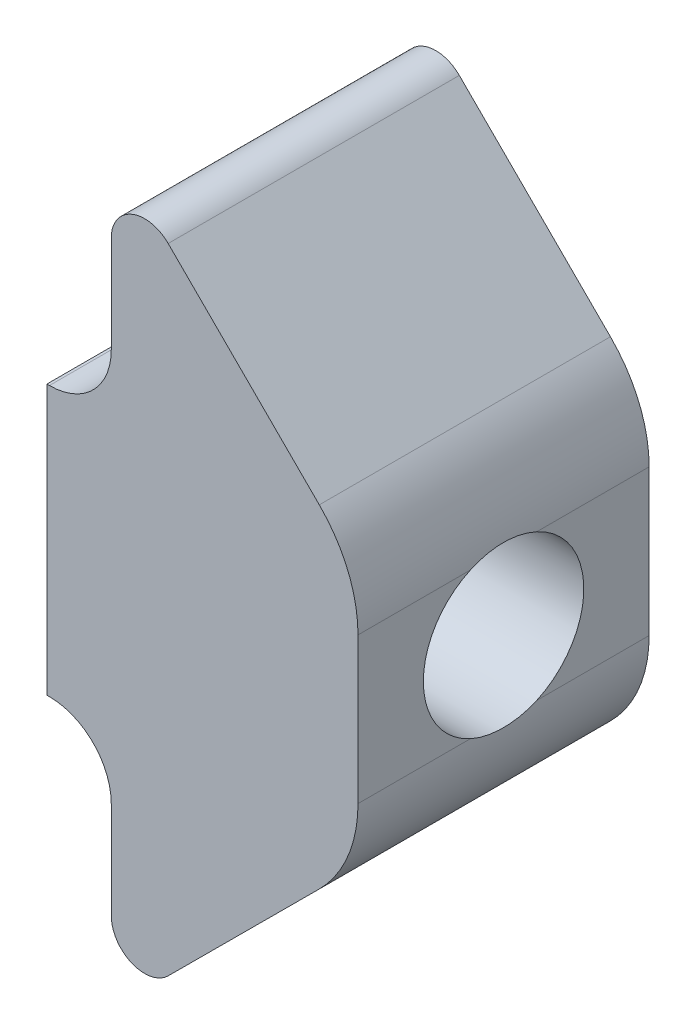
ISO-10303-21;
HEADER;
FILE_DESCRIPTION(('STEP AP214'),'2;1');
FILE_NAME('part.step','',(''),(''),'','','');
FILE_SCHEMA(('AUTOMOTIVE_DESIGN { 1 0 10303 214 1 1 1 1 }'));
ENDSEC;
DATA;
#1=APPLICATION_CONTEXT('core data for automotive mechanical design processes');
#2=APPLICATION_PROTOCOL_DEFINITION('international standard','automotive_design',2000,#1);
#3=PRODUCT_CONTEXT('',#1,'mechanical');
#4=PRODUCT('Part','Part','',(#3));
#5=PRODUCT_RELATED_PRODUCT_CATEGORY('part','',(#4));
#6=PRODUCT_DEFINITION_FORMATION('','',#4);
#7=PRODUCT_DEFINITION_CONTEXT('part definition',#1,'design');
#8=PRODUCT_DEFINITION('design','',#6,#7);
#9=PRODUCT_DEFINITION_SHAPE('','',#8);
#10=(LENGTH_UNIT() NAMED_UNIT(*) SI_UNIT(.MILLI.,.METRE.));
#11=(NAMED_UNIT(*) PLANE_ANGLE_UNIT() SI_UNIT($,.RADIAN.));
#12=(NAMED_UNIT(*) SI_UNIT($,.STERADIAN.) SOLID_ANGLE_UNIT());
#13=UNCERTAINTY_MEASURE_WITH_UNIT(LENGTH_MEASURE(1.E-05),#10,'distance_accuracy_value','');
#14=(GEOMETRIC_REPRESENTATION_CONTEXT(3) GLOBAL_UNCERTAINTY_ASSIGNED_CONTEXT((#13)) GLOBAL_UNIT_ASSIGNED_CONTEXT((#10,
#11,#12)) REPRESENTATION_CONTEXT('',''));
#15=CARTESIAN_POINT('',(0.,0.,0.));
#16=DIRECTION('',(0.,0.,1.));
#17=DIRECTION('',(1.,0.,0.));
#18=AXIS2_PLACEMENT_3D('',#15,#16,#17);
#19=CARTESIAN_POINT('',(-4.80850000000001,1.59318550686057,6.35));
#20=DIRECTION('',(1.,0.,0.));
#21=DIRECTION('',(0.,1.,0.));
#22=AXIS2_PLACEMENT_3D('',#19,#20,#21);
#23=PLANE('',#22);
#24=CARTESIAN_POINT('',(-4.80850000000001,0.,3.175));
#25=DIRECTION('',(1.,0.,0.));
#26=DIRECTION('',(0.,1.,0.));
#27=AXIS2_PLACEMENT_3D('',#24,#25,#26);
#28=CIRCLE('',#27,1.75);
#29=CARTESIAN_POINT('',(-4.8085,-1.59318550686057,3.89905796779638));
#30=VERTEX_POINT('',#29);
#31=CARTESIAN_POINT('',(-4.80850000000002,1.59318550686057,3.89905796779638));
#32=VERTEX_POINT('',#31);
#33=EDGE_CURVE('E289',#30,#32,#28,.F.);
#34=ORIENTED_EDGE('',*,*,#33,.T.);
#35=DIRECTION('',(0.,0.,-1.));
#36=VECTOR('',#35,1.);
#37=CARTESIAN_POINT('',(-4.80850000000002,1.59318550686057,6.35));
#38=LINE('',#37,#36);
#39=CARTESIAN_POINT('',(-4.80850000000002,1.59318550686057,6.35));
#40=VERTEX_POINT('',#39);
#41=EDGE_CURVE('E232',#40,#32,#38,.T.);
#42=ORIENTED_EDGE('',*,*,#41,.F.);
#43=DIRECTION('',(0.,-1.,0.));
#44=VECTOR('',#43,1.);
#45=CARTESIAN_POINT('',(-4.80850000000001,1.59318550686057,6.35));
#46=LINE('',#45,#44);
#47=CARTESIAN_POINT('',(-4.8085,-1.59318550686057,6.35));
#48=VERTEX_POINT('',#47);
#49=EDGE_CURVE('E341',#40,#48,#46,.T.);
#50=ORIENTED_EDGE('',*,*,#49,.T.);
#51=DIRECTION('',(0.,0.,-1.));
#52=VECTOR('',#51,1.);
#53=CARTESIAN_POINT('',(-4.8085,-1.59318550686057,6.35));
#54=LINE('',#53,#52);
#55=EDGE_CURVE('E228',#48,#30,#54,.T.);
#56=ORIENTED_EDGE('',*,*,#55,.T.);
#57=EDGE_LOOP('',(#34,#42,#50,#56));
#58=FACE_BOUND('',#57,.T.);
#59=ADVANCED_FACE('F36',(#58),#23,.T.);
#60=CARTESIAN_POINT('',(-11.5392124071298,-2.93845688183043,6.35));
#61=DIRECTION('',(0.,-1.,0.));
#62=DIRECTION('',(1.,0.,0.));
#63=AXIS2_PLACEMENT_3D('',#60,#61,#62);
#64=PLANE('',#63);
#65=DIRECTION('',(-1.,0.,0.));
#66=VECTOR('',#65,1.);
#67=CARTESIAN_POINT('',(-11.5392124071298,-2.93845688183043,0.));
#68=LINE('',#67,#66);
#69=CARTESIAN_POINT('',(-11.5392124071298,-2.93845688183043,0.));
#70=VERTEX_POINT('',#69);
#71=CARTESIAN_POINT('',(-11.5951,-2.93845688183043,0.));
#72=VERTEX_POINT('',#71);
#73=EDGE_CURVE('E182',#70,#72,#68,.T.);
#74=ORIENTED_EDGE('',*,*,#73,.F.);
#75=DIRECTION('',(0.,0.,-1.));
#76=VECTOR('',#75,1.);
#77=CARTESIAN_POINT('',(-11.5392124071298,-2.93845688183043,6.35));
#78=LINE('',#77,#76);
#79=CARTESIAN_POINT('',(-11.5392124071298,-2.93845688183043,6.35));
#80=VERTEX_POINT('',#79);
#81=EDGE_CURVE('E60',#80,#70,#78,.T.);
#82=ORIENTED_EDGE('',*,*,#81,.F.);
#83=DIRECTION('',(-1.,0.,0.));
#84=VECTOR('',#83,1.);
#85=CARTESIAN_POINT('',(-11.5392124071298,-2.93845688183043,6.35));
#86=LINE('',#85,#84);
#87=CARTESIAN_POINT('',(-11.5951,-2.93845688183043,6.35));
#88=VERTEX_POINT('',#87);
#89=EDGE_CURVE('E222',#80,#88,#86,.T.);
#90=ORIENTED_EDGE('',*,*,#89,.T.);
#91=DIRECTION('',(0.,0.,-1.));
#92=VECTOR('',#91,1.);
#93=CARTESIAN_POINT('',(-11.5951,-2.93845688183043,6.35));
#94=LINE('',#93,#92);
#95=EDGE_CURVE('E117',#88,#72,#94,.T.);
#96=ORIENTED_EDGE('',*,*,#95,.T.);
#97=EDGE_LOOP('',(#74,#82,#90,#96));
#98=FACE_BOUND('',#97,.T.);
#99=ADVANCED_FACE('F262',(#98),#64,.T.);
#100=CARTESIAN_POINT('',(-11.5392124071298,-4.28746928896025,6.35));
#101=DIRECTION('',(0.,0.,-1.));
#102=DIRECTION('',(-1.,0.,0.));
#103=AXIS2_PLACEMENT_3D('',#100,#101,#102);
#104=CYLINDRICAL_SURFACE('',#103,1.34901240712982);
#105=CARTESIAN_POINT('',(-11.5392124071298,-4.28746928896025,0.));
#106=DIRECTION('',(0.,0.,1.));
#107=DIRECTION('',(1.,0.,0.));
#108=AXIS2_PLACEMENT_3D('',#105,#106,#107);
#109=CIRCLE('',#108,1.34901240712982);
#110=CARTESIAN_POINT('',(-10.1902,-4.28746928896025,0.));
#111=VERTEX_POINT('',#110);
#112=EDGE_CURVE('E219',#111,#70,#109,.T.);
#113=ORIENTED_EDGE('',*,*,#112,.F.);
#114=DIRECTION('',(0.,0.,-1.));
#115=VECTOR('',#114,1.);
#116=CARTESIAN_POINT('',(-10.1902,-4.28746928896025,6.35));
#117=LINE('',#116,#115);
#118=CARTESIAN_POINT('',(-10.1902,-4.28746928896025,6.35));
#119=VERTEX_POINT('',#118);
#120=EDGE_CURVE('E165',#119,#111,#117,.T.);
#121=ORIENTED_EDGE('',*,*,#120,.F.);
#122=CARTESIAN_POINT('',(-11.5392124071298,-4.28746928896025,6.35));
#123=DIRECTION('',(0.,0.,1.));
#124=DIRECTION('',(1.,0.,0.));
#125=AXIS2_PLACEMENT_3D('',#122,#123,#124);
#126=CIRCLE('',#125,1.34901240712982);
#127=EDGE_CURVE('E177',#119,#80,#126,.T.);
#128=ORIENTED_EDGE('',*,*,#127,.T.);
#129=ORIENTED_EDGE('',*,*,#81,.T.);
#130=EDGE_LOOP('',(#113,#121,#128,#129));
#131=FACE_BOUND('',#130,.T.);
#132=ADVANCED_FACE('F269',(#131),#104,.F.);
#133=CARTESIAN_POINT('',(-10.1902,-6.4020890233125,6.35));
#134=DIRECTION('',(-1.,0.,0.));
#135=DIRECTION('',(0.,0.,1.));
#136=AXIS2_PLACEMENT_3D('',#133,#134,#135);
#137=PLANE('',#136);
#138=DIRECTION('',(0.,1.,0.));
#139=VECTOR('',#138,1.);
#140=CARTESIAN_POINT('',(-10.1902,-6.4020890233125,0.));
#141=LINE('',#140,#139);
#142=CARTESIAN_POINT('',(-10.1902,-6.4020890233125,0.));
#143=VERTEX_POINT('',#142);
#144=EDGE_CURVE('E161',#143,#111,#141,.T.);
#145=ORIENTED_EDGE('',*,*,#144,.F.);
#146=DIRECTION('',(0.,0.,-1.));
#147=VECTOR('',#146,1.);
#148=CARTESIAN_POINT('',(-10.1902,-6.4020890233125,6.35));
#149=LINE('',#148,#147);
#150=CARTESIAN_POINT('',(-10.1902,-6.4020890233125,6.35));
#151=VERTEX_POINT('',#150);
#152=EDGE_CURVE('E154',#151,#143,#149,.T.);
#153=ORIENTED_EDGE('',*,*,#152,.F.);
#154=DIRECTION('',(0.,1.,0.));
#155=VECTOR('',#154,1.);
#156=CARTESIAN_POINT('',(-10.1902,-6.4020890233125,6.35));
#157=LINE('',#156,#155);
#158=EDGE_CURVE('E158',#151,#119,#157,.T.);
#159=ORIENTED_EDGE('',*,*,#158,.T.);
#160=ORIENTED_EDGE('',*,*,#120,.T.);
#161=EDGE_LOOP('',(#145,#153,#159,#160));
#162=FACE_BOUND('',#161,.T.);
#163=ADVANCED_FACE('F156',(#162),#137,.T.);
#164=CARTESIAN_POINT('',(-9.4627890233125,-6.4020890233125,6.35));
#165=DIRECTION('',(0.,0.,-1.));
#166=DIRECTION('',(-1.,0.,0.));
#167=AXIS2_PLACEMENT_3D('',#164,#165,#166);
#168=CYLINDRICAL_SURFACE('',#167,0.727410976687497);
#169=CARTESIAN_POINT('',(-9.4627890233125,-6.4020890233125,0.));
#170=DIRECTION('',(0.,0.,1.));
#171=DIRECTION('',(1.,0.,0.));
#172=AXIS2_PLACEMENT_3D('',#169,#170,#171);
#173=CIRCLE('',#172,0.727410976687497);
#174=CARTESIAN_POINT('',(-8.9490205596463,-6.91703435511728,0.));
#175=VERTEX_POINT('',#174);
#176=EDGE_CURVE('E216',#143,#175,#173,.T.);
#177=ORIENTED_EDGE('',*,*,#176,.T.);
#178=DIRECTION('',(0.,0.,-1.));
#179=VECTOR('',#178,1.);
#180=CARTESIAN_POINT('',(-8.9490205596463,-6.91703435511728,6.35));
#181=LINE('',#180,#179);
#182=CARTESIAN_POINT('',(-8.9490205596463,-6.91703435511728,6.35));
#183=VERTEX_POINT('',#182);
#184=EDGE_CURVE('E166',#183,#175,#181,.T.);
#185=ORIENTED_EDGE('',*,*,#184,.F.);
#186=CARTESIAN_POINT('',(-9.4627890233125,-6.4020890233125,6.35));
#187=DIRECTION('',(0.,0.,1.));
#188=DIRECTION('',(1.,0.,0.));
#189=AXIS2_PLACEMENT_3D('',#186,#187,#188);
#190=CIRCLE('',#189,0.727410976687497);
#191=EDGE_CURVE('E169',#151,#183,#190,.T.);
#192=ORIENTED_EDGE('',*,*,#191,.F.);
#193=ORIENTED_EDGE('',*,*,#152,.T.);
#194=EDGE_LOOP('',(#177,#185,#192,#193));
#195=FACE_BOUND('',#194,.T.);
#196=ADVANCED_FACE('F170',(#195),#168,.T.);
#197=CARTESIAN_POINT('',(-5.65289504574608,-3.62844188377221,6.35));
#198=DIRECTION('',(0.706297375392672,-0.707915261534474,0.));
#199=DIRECTION('',(0.707915261534474,0.706297375392672,0.));
#200=AXIS2_PLACEMENT_3D('',#197,#198,#199);
#201=PLANE('',#200);
#202=DIRECTION('',(-0.707915261534474,-0.706297375392672,0.));
#203=VECTOR('',#202,1.);
#204=CARTESIAN_POINT('',(-5.65289504574608,-3.62844188377221,0.));
#205=LINE('',#204,#203);
#206=CARTESIAN_POINT('',(-5.65289504574608,-3.62844188377221,0.));
#207=VERTEX_POINT('',#206);
#208=EDGE_CURVE('E213',#207,#175,#205,.T.);
#209=ORIENTED_EDGE('',*,*,#208,.F.);
#210=DIRECTION('',(0.,0.,-1.));
#211=VECTOR('',#210,1.);
#212=CARTESIAN_POINT('',(-5.65289504574608,-3.62844188377221,6.35));
#213=LINE('',#212,#211);
#214=CARTESIAN_POINT('',(-5.65289504574608,-3.62844188377221,6.35));
#215=VERTEX_POINT('',#214);
#216=EDGE_CURVE('E226',#215,#207,#213,.T.);
#217=ORIENTED_EDGE('',*,*,#216,.F.);
#218=DIRECTION('',(-0.707915261534474,-0.706297375392672,0.));
#219=VECTOR('',#218,1.);
#220=CARTESIAN_POINT('',(-5.65289504574608,-3.62844188377221,6.35));
#221=LINE('',#220,#219);
#222=EDGE_CURVE('E174',#215,#183,#221,.T.);
#223=ORIENTED_EDGE('',*,*,#222,.T.);
#224=ORIENTED_EDGE('',*,*,#184,.T.);
#225=EDGE_LOOP('',(#209,#217,#223,#224));
#226=FACE_BOUND('',#225,.T.);
#227=ADVANCED_FACE('F283',(#226),#201,.T.);
#228=CARTESIAN_POINT('',(-7.68350000000002,-1.59318550686057,6.35));
#229=DIRECTION('',(0.,0.,-1.));
#230=DIRECTION('',(-1.,0.,0.));
#231=AXIS2_PLACEMENT_3D('',#228,#229,#230);
#232=CYLINDRICAL_SURFACE('',#231,2.87500000000003);
#233=CARTESIAN_POINT('',(-4.8085,-1.59318550686057,2.45094203220362));
#234=VERTEX_POINT('',#233);
#235=CARTESIAN_POINT('',(-4.8085,-1.59318550686057,0.));
#236=VERTEX_POINT('',#235);
#237=EDGE_CURVE('E231',#234,#236,#54,.T.);
#238=ORIENTED_EDGE('',*,*,#237,.F.);
#239=CARTESIAN_POINT('',(-4.8085,-1.59318550686057,3.89905796779638));
#240=CARTESIAN_POINT('',(-4.80850696578926,-1.61354211753861,3.8542775523129));
#241=CARTESIAN_POINT('',(-4.80871647230555,-1.63200069355745,3.80863808496439));
#242=CARTESIAN_POINT('',(-4.80934811754923,-1.66501233144936,3.71597040859976));
#243=CARTESIAN_POINT('',(-4.8097702507682,-1.67956549448328,3.66894223558993));
#244=CARTESIAN_POINT('',(-4.81063466138894,-1.70465621247682,3.57383065723409));
#245=CARTESIAN_POINT('',(-4.8110769360291,-1.71519431610204,3.52574739701821));
#246=CARTESIAN_POINT('',(-4.81185008773175,-1.73218559578378,3.4288778942963));
#247=CARTESIAN_POINT('',(-4.81218096923883,-1.73863893483173,3.38009167991921));
#248=CARTESIAN_POINT('',(-4.81285989864712,-1.75179425585051,3.23311644990264));
#249=CARTESIAN_POINT('',(-4.81289437645996,-1.75229438956668,3.13430001115188));
#250=CARTESIAN_POINT('',(-4.81207374150861,-1.73668178236994,2.93812966893667));
#251=CARTESIAN_POINT('',(-4.8112197917503,-1.72059076053768,2.84077402224094));
#252=CARTESIAN_POINT('',(-4.80989805860319,-1.68368869761242,2.69498106398093));
#253=CARTESIAN_POINT('',(-4.80943709761814,-1.66863545970306,2.64502559650784));
#254=CARTESIAN_POINT('',(-4.80874161613421,-1.63415650535987,2.54671482958506));
#255=CARTESIAN_POINT('',(-4.80850681723257,-1.61473620116796,2.4983576337145));
#256=CARTESIAN_POINT('',(-4.8085,-1.59318550686057,2.45094203220362));
#257=B_SPLINE_CURVE_WITH_KNOTS('',3,(#239,#240,#241,#242,#243,#244,#245,#246,#247,#248,#249,
#250,#251,#252,#253,#254,#255,#256),.UNSPECIFIED.,.F.,.F.,(4,2,2,2,2,2,2,2,4),(0.,
0.147521066360579,0.295038311154192,0.442535390195395,0.590026583394895,0.884975782653118,
1.17953936065454,1.33588250854209,1.49203295302535),.UNSPECIFIED.);
#258=EDGE_CURVE('E186',#30,#234,#257,.T.);
#259=ORIENTED_EDGE('',*,*,#258,.F.);
#260=ORIENTED_EDGE('',*,*,#55,.F.);
#261=CARTESIAN_POINT('',(-7.68350000000002,-1.59318550686057,6.35));
#262=DIRECTION('',(0.,0.,1.));
#263=DIRECTION('',(1.,0.,0.));
#264=AXIS2_PLACEMENT_3D('',#261,#262,#263);
#265=CIRCLE('',#264,2.87500000000003);
#266=EDGE_CURVE('E344',#215,#48,#265,.T.);
#267=ORIENTED_EDGE('',*,*,#266,.F.);
#268=ORIENTED_EDGE('',*,*,#216,.T.);
#269=CARTESIAN_POINT('',(-7.68350000000002,-1.59318550686057,0.));
#270=DIRECTION('',(0.,0.,1.));
#271=DIRECTION('',(1.,0.,0.));
#272=AXIS2_PLACEMENT_3D('',#269,#270,#271);
#273=CIRCLE('',#272,2.87500000000003);
#274=EDGE_CURVE('E210',#207,#236,#273,.T.);
#275=ORIENTED_EDGE('',*,*,#274,.T.);
#276=EDGE_LOOP('',(#238,#259,#260,#267,#268,#275));
#277=FACE_BOUND('',#276,.T.);
#278=ADVANCED_FACE('F275',(#277),#232,.T.);
#279=CARTESIAN_POINT('',(-4.80850000000002,1.59318550686057,2.45094203220364));
#280=VERTEX_POINT('',#279);
#281=EDGE_CURVE('E51',#280,#234,#28,.F.);
#282=ORIENTED_EDGE('',*,*,#281,.T.);
#283=ORIENTED_EDGE('',*,*,#237,.T.);
#284=DIRECTION('',(0.,-1.,0.));
#285=VECTOR('',#284,1.);
#286=CARTESIAN_POINT('',(-4.80850000000001,1.59318550686057,0.));
#287=LINE('',#286,#285);
#288=CARTESIAN_POINT('',(-4.80850000000002,1.59318550686057,0.));
#289=VERTEX_POINT('',#288);
#290=EDGE_CURVE('E207',#289,#236,#287,.T.);
#291=ORIENTED_EDGE('',*,*,#290,.F.);
#292=EDGE_CURVE('E235',#280,#289,#38,.T.);
#293=ORIENTED_EDGE('',*,*,#292,.F.);
#294=EDGE_LOOP('',(#282,#283,#291,#293));
#295=FACE_BOUND('',#294,.T.);
#296=ADVANCED_FACE('F265',(#295),#23,.T.);
#297=CARTESIAN_POINT('',(-7.68350000000002,1.59318550686057,6.35));
#298=DIRECTION('',(0.,0.,-1.));
#299=DIRECTION('',(-1.,0.,0.));
#300=AXIS2_PLACEMENT_3D('',#297,#298,#299);
#301=CYLINDRICAL_SURFACE('',#300,2.87500000000001);
#302=ORIENTED_EDGE('',*,*,#41,.T.);
#303=CARTESIAN_POINT('',(-4.80850000000002,1.59318550686057,2.45094203220362));
#304=CARTESIAN_POINT('',(-4.80850696578928,1.61354211753861,2.4957224476871));
#305=CARTESIAN_POINT('',(-4.80871647230557,1.63200069355745,2.54136191503561));
#306=CARTESIAN_POINT('',(-4.80934811754925,1.66501233144936,2.63402959140024));
#307=CARTESIAN_POINT('',(-4.80977025076822,1.67956549448328,2.68105776441007));
#308=CARTESIAN_POINT('',(-4.81063466138896,1.70465621247682,2.77616934276591));
#309=CARTESIAN_POINT('',(-4.81107693602912,1.71519431610204,2.82425260298179));
#310=CARTESIAN_POINT('',(-4.81185008773176,1.73218559578378,2.9211221057037));
#311=CARTESIAN_POINT('',(-4.81218096923885,1.73863893483173,2.96990832008079));
#312=CARTESIAN_POINT('',(-4.81285989864714,1.75179425585051,3.11688355009736));
#313=CARTESIAN_POINT('',(-4.81289437645998,1.75229438956668,3.21569998884813));
#314=CARTESIAN_POINT('',(-4.81207374150863,1.73668178236994,3.41187033106333));
#315=CARTESIAN_POINT('',(-4.81121979175032,1.72059076053768,3.50922597775906));
#316=CARTESIAN_POINT('',(-4.80989805860321,1.68368869761242,3.65501893601908));
#317=CARTESIAN_POINT('',(-4.80943709761815,1.66863545970306,3.70497440349217));
#318=CARTESIAN_POINT('',(-4.80874161613422,1.63415650535987,3.80328517041494));
#319=CARTESIAN_POINT('',(-4.80850681723258,1.61473620116796,3.8516423662855));
#320=CARTESIAN_POINT('',(-4.80850000000002,1.59318550686057,3.89905796779638));
#321=B_SPLINE_CURVE_WITH_KNOTS('',3,(#303,#304,#305,#306,#307,#308,#309,#310,#311,#312,#313,
#314,#315,#316,#317,#318,#319,#320),.UNSPECIFIED.,.F.,.F.,(4,2,2,2,2,2,2,2,4),(0.,
0.147521066360579,0.295038311154192,0.442535390195396,0.590026583394895,0.884975782653119,
1.17953936065454,1.33588250854209,1.49203295302535),.UNSPECIFIED.);
#322=EDGE_CURVE('E303',#280,#32,#321,.T.);
#323=ORIENTED_EDGE('',*,*,#322,.F.);
#324=ORIENTED_EDGE('',*,*,#292,.T.);
#325=CARTESIAN_POINT('',(-7.68350000000002,1.59318550686057,0.));
#326=DIRECTION('',(0.,0.,1.));
#327=DIRECTION('',(1.,0.,0.));
#328=AXIS2_PLACEMENT_3D('',#325,#326,#327);
#329=CIRCLE('',#328,2.87500000000001);
#330=CARTESIAN_POINT('',(-5.65289504574608,3.62844188377218,0.));
#331=VERTEX_POINT('',#330);
#332=EDGE_CURVE('E204',#289,#331,#329,.T.);
#333=ORIENTED_EDGE('',*,*,#332,.T.);
#334=DIRECTION('',(0.,0.,-1.));
#335=VECTOR('',#334,1.);
#336=CARTESIAN_POINT('',(-5.65289504574608,3.62844188377218,6.35));
#337=LINE('',#336,#335);
#338=CARTESIAN_POINT('',(-5.65289504574608,3.62844188377218,6.35));
#339=VERTEX_POINT('',#338);
#340=EDGE_CURVE('E236',#339,#331,#337,.T.);
#341=ORIENTED_EDGE('',*,*,#340,.F.);
#342=CARTESIAN_POINT('',(-7.68350000000002,1.59318550686057,6.35));
#343=DIRECTION('',(0.,0.,1.));
#344=DIRECTION('',(1.,0.,0.));
#345=AXIS2_PLACEMENT_3D('',#342,#343,#344);
#346=CIRCLE('',#345,2.87500000000001);
#347=EDGE_CURVE('E339',#40,#339,#346,.T.);
#348=ORIENTED_EDGE('',*,*,#347,.F.);
#349=EDGE_LOOP('',(#302,#323,#324,#333,#341,#348));
#350=FACE_BOUND('',#349,.T.);
#351=ADVANCED_FACE('F274',(#350),#301,.T.);
#352=CARTESIAN_POINT('',(-8.9490205596463,6.91703435511728,6.35));
#353=DIRECTION('',(0.706297375392675,0.707915261534471,0.));
#354=DIRECTION('',(-0.707915261534471,0.706297375392675,0.));
#355=AXIS2_PLACEMENT_3D('',#352,#353,#354);
#356=PLANE('',#355);
#357=DIRECTION('',(0.707915261534471,-0.706297375392675,0.));
#358=VECTOR('',#357,1.);
#359=CARTESIAN_POINT('',(-8.9490205596463,6.91703435511728,0.));
#360=LINE('',#359,#358);
#361=CARTESIAN_POINT('',(-8.9490205596463,6.91703435511727,0.));
#362=VERTEX_POINT('',#361);
#363=EDGE_CURVE('E201',#362,#331,#360,.T.);
#364=ORIENTED_EDGE('',*,*,#363,.F.);
#365=DIRECTION('',(0.,0.,-1.));
#366=VECTOR('',#365,1.);
#367=CARTESIAN_POINT('',(-8.9490205596463,6.91703435511727,6.35));
#368=LINE('',#367,#366);
#369=CARTESIAN_POINT('',(-8.9490205596463,6.91703435511727,6.35));
#370=VERTEX_POINT('',#369);
#371=EDGE_CURVE('E238',#370,#362,#368,.T.);
#372=ORIENTED_EDGE('',*,*,#371,.F.);
#373=DIRECTION('',(0.707915261534471,-0.706297375392675,0.));
#374=VECTOR('',#373,1.);
#375=CARTESIAN_POINT('',(-8.9490205596463,6.91703435511728,6.35));
#376=LINE('',#375,#374);
#377=EDGE_CURVE('E337',#370,#339,#376,.T.);
#378=ORIENTED_EDGE('',*,*,#377,.T.);
#379=ORIENTED_EDGE('',*,*,#340,.T.);
#380=EDGE_LOOP('',(#364,#372,#378,#379));
#381=FACE_BOUND('',#380,.T.);
#382=ADVANCED_FACE('F281',(#381),#356,.T.);
#383=CARTESIAN_POINT('',(-9.4627890233125,6.4020890233125,6.35));
#384=DIRECTION('',(0.,0.,-1.));
#385=DIRECTION('',(-1.,0.,0.));
#386=AXIS2_PLACEMENT_3D('',#383,#384,#385);
#387=CYLINDRICAL_SURFACE('',#386,0.727410976687497);
#388=CARTESIAN_POINT('',(-9.4627890233125,6.4020890233125,0.));
#389=DIRECTION('',(0.,0.,1.));
#390=DIRECTION('',(1.,0.,0.));
#391=AXIS2_PLACEMENT_3D('',#388,#389,#390);
#392=CIRCLE('',#391,0.727410976687497);
#393=CARTESIAN_POINT('',(-10.1902,6.4020890233125,0.));
#394=VERTEX_POINT('',#393);
#395=EDGE_CURVE('E198',#362,#394,#392,.T.);
#396=ORIENTED_EDGE('',*,*,#395,.T.);
#397=DIRECTION('',(0.,0.,-1.));
#398=VECTOR('',#397,1.);
#399=CARTESIAN_POINT('',(-10.1902,6.4020890233125,6.35));
#400=LINE('',#399,#398);
#401=CARTESIAN_POINT('',(-10.1902,6.4020890233125,6.35));
#402=VERTEX_POINT('',#401);
#403=EDGE_CURVE('E240',#402,#394,#400,.T.);
#404=ORIENTED_EDGE('',*,*,#403,.F.);
#405=CARTESIAN_POINT('',(-9.4627890233125,6.4020890233125,6.35));
#406=DIRECTION('',(0.,0.,1.));
#407=DIRECTION('',(1.,0.,0.));
#408=AXIS2_PLACEMENT_3D('',#405,#406,#407);
#409=CIRCLE('',#408,0.727410976687497);
#410=EDGE_CURVE('E335',#370,#402,#409,.T.);
#411=ORIENTED_EDGE('',*,*,#410,.F.);
#412=ORIENTED_EDGE('',*,*,#371,.T.);
#413=EDGE_LOOP('',(#396,#404,#411,#412));
#414=FACE_BOUND('',#413,.T.);
#415=ADVANCED_FACE('F353',(#414),#387,.T.);
#416=CARTESIAN_POINT('',(-10.1902,4.28746928896025,6.35));
#417=DIRECTION('',(-1.,0.,0.));
#418=DIRECTION('',(0.,0.,1.));
#419=AXIS2_PLACEMENT_3D('',#416,#417,#418);
#420=PLANE('',#419);
#421=DIRECTION('',(0.,1.,0.));
#422=VECTOR('',#421,1.);
#423=CARTESIAN_POINT('',(-10.1902,4.28746928896025,0.));
#424=LINE('',#423,#422);
#425=CARTESIAN_POINT('',(-10.1902,4.28746928896025,0.));
#426=VERTEX_POINT('',#425);
#427=EDGE_CURVE('E195',#426,#394,#424,.T.);
#428=ORIENTED_EDGE('',*,*,#427,.F.);
#429=DIRECTION('',(0.,0.,-1.));
#430=VECTOR('',#429,1.);
#431=CARTESIAN_POINT('',(-10.1902,4.28746928896025,6.35));
#432=LINE('',#431,#430);
#433=CARTESIAN_POINT('',(-10.1902,4.28746928896025,6.35));
#434=VERTEX_POINT('',#433);
#435=EDGE_CURVE('E242',#434,#426,#432,.T.);
#436=ORIENTED_EDGE('',*,*,#435,.F.);
#437=DIRECTION('',(0.,1.,0.));
#438=VECTOR('',#437,1.);
#439=CARTESIAN_POINT('',(-10.1902,4.28746928896025,6.35));
#440=LINE('',#439,#438);
#441=EDGE_CURVE('E332',#434,#402,#440,.T.);
#442=ORIENTED_EDGE('',*,*,#441,.T.);
#443=ORIENTED_EDGE('',*,*,#403,.T.);
#444=EDGE_LOOP('',(#428,#436,#442,#443));
#445=FACE_BOUND('',#444,.T.);
#446=ADVANCED_FACE('F356',(#445),#420,.T.);
#447=CARTESIAN_POINT('',(-11.5392124071298,4.28746928896025,6.35));
#448=DIRECTION('',(0.,0.,-1.));
#449=DIRECTION('',(-1.,0.,0.));
#450=AXIS2_PLACEMENT_3D('',#447,#448,#449);
#451=CYLINDRICAL_SURFACE('',#450,1.34901240712982);
#452=CARTESIAN_POINT('',(-11.5392124071298,4.28746928896025,0.));
#453=DIRECTION('',(0.,0.,1.));
#454=DIRECTION('',(1.,0.,0.));
#455=AXIS2_PLACEMENT_3D('',#452,#453,#454);
#456=CIRCLE('',#455,1.34901240712982);
#457=CARTESIAN_POINT('',(-11.5392124071298,2.93845688183043,0.));
#458=VERTEX_POINT('',#457);
#459=EDGE_CURVE('E192',#458,#426,#456,.T.);
#460=ORIENTED_EDGE('',*,*,#459,.F.);
#461=DIRECTION('',(0.,0.,-1.));
#462=VECTOR('',#461,1.);
#463=CARTESIAN_POINT('',(-11.5392124071298,2.93845688183043,6.35));
#464=LINE('',#463,#462);
#465=CARTESIAN_POINT('',(-11.5392124071298,2.93845688183043,6.35));
#466=VERTEX_POINT('',#465);
#467=EDGE_CURVE('E244',#466,#458,#464,.T.);
#468=ORIENTED_EDGE('',*,*,#467,.F.);
#469=CARTESIAN_POINT('',(-11.5392124071298,4.28746928896025,6.35));
#470=DIRECTION('',(0.,0.,1.));
#471=DIRECTION('',(1.,0.,0.));
#472=AXIS2_PLACEMENT_3D('',#469,#470,#471);
#473=CIRCLE('',#472,1.34901240712982);
#474=EDGE_CURVE('E329',#466,#434,#473,.T.);
#475=ORIENTED_EDGE('',*,*,#474,.T.);
#476=ORIENTED_EDGE('',*,*,#435,.T.);
#477=EDGE_LOOP('',(#460,#468,#475,#476));
#478=FACE_BOUND('',#477,.T.);
#479=ADVANCED_FACE('F361',(#478),#451,.F.);
#480=CARTESIAN_POINT('',(-11.5951,2.93845688183043,6.35));
#481=DIRECTION('',(0.,1.,0.));
#482=DIRECTION('',(0.,0.,1.));
#483=AXIS2_PLACEMENT_3D('',#480,#481,#482);
#484=PLANE('',#483);
#485=DIRECTION('',(1.,0.,0.));
#486=VECTOR('',#485,1.);
#487=CARTESIAN_POINT('',(-11.5951,2.93845688183043,0.));
#488=LINE('',#487,#486);
#489=CARTESIAN_POINT('',(-11.5951,2.93845688183043,0.));
#490=VERTEX_POINT('',#489);
#491=EDGE_CURVE('E189',#490,#458,#488,.T.);
#492=ORIENTED_EDGE('',*,*,#491,.F.);
#493=DIRECTION('',(0.,0.,-1.));
#494=VECTOR('',#493,1.);
#495=CARTESIAN_POINT('',(-11.5951,2.93845688183043,6.35));
#496=LINE('',#495,#494);
#497=CARTESIAN_POINT('',(-11.5951,2.93845688183043,6.35));
#498=VERTEX_POINT('',#497);
#499=EDGE_CURVE('E246',#498,#490,#496,.T.);
#500=ORIENTED_EDGE('',*,*,#499,.F.);
#501=DIRECTION('',(1.,0.,0.));
#502=VECTOR('',#501,1.);
#503=CARTESIAN_POINT('',(-11.5951,2.93845688183043,6.35));
#504=LINE('',#503,#502);
#505=EDGE_CURVE('E326',#498,#466,#504,.T.);
#506=ORIENTED_EDGE('',*,*,#505,.T.);
#507=ORIENTED_EDGE('',*,*,#467,.T.);
#508=EDGE_LOOP('',(#492,#500,#506,#507));
#509=FACE_BOUND('',#508,.T.);
#510=ADVANCED_FACE('F364',(#509),#484,.T.);
#511=CARTESIAN_POINT('',(-11.5951,-2.93845688183043,6.35));
#512=DIRECTION('',(-1.,0.,0.));
#513=DIRECTION('',(0.,0.,1.));
#514=AXIS2_PLACEMENT_3D('',#511,#512,#513);
#515=PLANE('',#514);
#516=CARTESIAN_POINT('',(-11.5951,0.,3.175));
#517=DIRECTION('',(-1.,0.,0.));
#518=DIRECTION('',(0.,0.,1.));
#519=AXIS2_PLACEMENT_3D('',#516,#517,#518);
#520=CIRCLE('',#519,1.95);
#521=CARTESIAN_POINT('',(-11.5951,0.,5.125));
#522=VERTEX_POINT('',#521);
#523=EDGE_CURVE('E11',#522,#522,#520,.F.);
#524=ORIENTED_EDGE('',*,*,#523,.T.);
#525=EDGE_LOOP('',(#524));
#526=FACE_BOUND('',#525,.T.);
#527=DIRECTION('',(0.,1.,0.));
#528=VECTOR('',#527,1.);
#529=CARTESIAN_POINT('',(-11.5951,-2.93845688183043,0.));
#530=LINE('',#529,#528);
#531=EDGE_CURVE('E185',#72,#490,#530,.T.);
#532=ORIENTED_EDGE('',*,*,#531,.F.);
#533=ORIENTED_EDGE('',*,*,#95,.F.);
#534=DIRECTION('',(0.,1.,0.));
#535=VECTOR('',#534,1.);
#536=CARTESIAN_POINT('',(-11.5951,-2.93845688183043,6.35));
#537=LINE('',#536,#535);
#538=EDGE_CURVE('E324',#88,#498,#537,.T.);
#539=ORIENTED_EDGE('',*,*,#538,.T.);
#540=ORIENTED_EDGE('',*,*,#499,.T.);
#541=EDGE_LOOP('',(#532,#533,#539,#540));
#542=FACE_BOUND('',#541,.T.);
#543=ADVANCED_FACE('F365',(#526,#542),#515,.T.);
#544=CARTESIAN_POINT('',(-11.5392124071298,4.28746928896025,6.35));
#545=DIRECTION('',(0.,0.,1.));
#546=DIRECTION('',(1.,0.,0.));
#547=AXIS2_PLACEMENT_3D('',#544,#545,#546);
#548=PLANE('',#547);
#549=ORIENTED_EDGE('',*,*,#89,.F.);
#550=ORIENTED_EDGE('',*,*,#127,.F.);
#551=ORIENTED_EDGE('',*,*,#158,.F.);
#552=ORIENTED_EDGE('',*,*,#191,.T.);
#553=ORIENTED_EDGE('',*,*,#222,.F.);
#554=ORIENTED_EDGE('',*,*,#266,.T.);
#555=ORIENTED_EDGE('',*,*,#49,.F.);
#556=ORIENTED_EDGE('',*,*,#347,.T.);
#557=ORIENTED_EDGE('',*,*,#377,.F.);
#558=ORIENTED_EDGE('',*,*,#410,.T.);
#559=ORIENTED_EDGE('',*,*,#441,.F.);
#560=ORIENTED_EDGE('',*,*,#474,.F.);
#561=ORIENTED_EDGE('',*,*,#505,.F.);
#562=ORIENTED_EDGE('',*,*,#538,.F.);
#563=EDGE_LOOP('',(#549,#550,#551,#552,#553,#554,#555,#556,#557,#558,#559,#560,#561,#562));
#564=FACE_BOUND('',#563,.T.);
#565=ADVANCED_FACE('F176',(#564),#548,.T.);
#566=CARTESIAN_POINT('',(-11.5392124071298,4.28746928896025,0.));
#567=DIRECTION('',(0.,0.,1.));
#568=DIRECTION('',(1.,0.,0.));
#569=AXIS2_PLACEMENT_3D('',#566,#567,#568);
#570=PLANE('',#569);
#571=ORIENTED_EDGE('',*,*,#73,.T.);
#572=ORIENTED_EDGE('',*,*,#531,.T.);
#573=ORIENTED_EDGE('',*,*,#491,.T.);
#574=ORIENTED_EDGE('',*,*,#459,.T.);
#575=ORIENTED_EDGE('',*,*,#427,.T.);
#576=ORIENTED_EDGE('',*,*,#395,.F.);
#577=ORIENTED_EDGE('',*,*,#363,.T.);
#578=ORIENTED_EDGE('',*,*,#332,.F.);
#579=ORIENTED_EDGE('',*,*,#290,.T.);
#580=ORIENTED_EDGE('',*,*,#274,.F.);
#581=ORIENTED_EDGE('',*,*,#208,.T.);
#582=ORIENTED_EDGE('',*,*,#176,.F.);
#583=ORIENTED_EDGE('',*,*,#144,.T.);
#584=ORIENTED_EDGE('',*,*,#112,.T.);
#585=EDGE_LOOP('',(#571,#572,#573,#574,#575,#576,#577,#578,#579,#580,#581,#582,#583,#584));
#586=FACE_BOUND('',#585,.T.);
#587=ADVANCED_FACE('F258',(#586),#570,.F.);
#588=CARTESIAN_POINT('',(-4.8075,0.,3.175));
#589=DIRECTION('',(-1.,0.,0.));
#590=DIRECTION('',(0.,0.,1.));
#591=AXIS2_PLACEMENT_3D('',#588,#589,#590);
#592=CYLINDRICAL_SURFACE('',#591,1.75);
#593=CARTESIAN_POINT('',(-11.3951,0.,3.175));
#594=DIRECTION('',(-1.,0.,0.));
#595=DIRECTION('',(0.,0.,1.));
#596=AXIS2_PLACEMENT_3D('',#593,#594,#595);
#597=CIRCLE('',#596,1.75);
#598=CARTESIAN_POINT('',(-11.3951,0.,4.925));
#599=VERTEX_POINT('',#598);
#600=EDGE_CURVE('E44',#599,#599,#597,.T.);
#601=ORIENTED_EDGE('',*,*,#600,.T.);
#602=EDGE_LOOP('',(#601));
#603=FACE_BOUND('',#602,.T.);
#604=ORIENTED_EDGE('',*,*,#258,.T.);
#605=ORIENTED_EDGE('',*,*,#281,.F.);
#606=ORIENTED_EDGE('',*,*,#322,.T.);
#607=ORIENTED_EDGE('',*,*,#33,.F.);
#608=EDGE_LOOP('',(#604,#605,#606,#607));
#609=FACE_BOUND('',#608,.T.);
#610=ADVANCED_FACE('F251',(#603,#609),#592,.F.);
#611=CARTESIAN_POINT('',(-11.3951,0.,3.175));
#612=DIRECTION('',(-1.,0.,0.));
#613=DIRECTION('',(0.,0.,1.));
#614=AXIS2_PLACEMENT_3D('',#611,#612,#613);
#615=TOROIDAL_SURFACE('',#614,1.95,0.2);
#616=ORIENTED_EDGE('',*,*,#523,.F.);
#617=EDGE_LOOP('',(#616));
#618=FACE_BOUND('',#617,.T.);
#619=ORIENTED_EDGE('',*,*,#600,.F.);
#620=EDGE_LOOP('',(#619));
#621=FACE_BOUND('',#620,.T.);
#622=ADVANCED_FACE('F38',(#618,#621),#615,.T.);
#623=CLOSED_SHELL('',(#59,#99,#132,#163,#196,#227,#278,#296,#351,#382,#415,#446,#479,#510,#543,
#565,#587,#610,#622));
#624=MANIFOLD_SOLID_BREP('B2',#623);
#625=ADVANCED_BREP_SHAPE_REPRESENTATION('',(#18,#624),#14);
#626=SHAPE_DEFINITION_REPRESENTATION(#9,#625);
ENDSEC;
END-ISO-10303-21;
